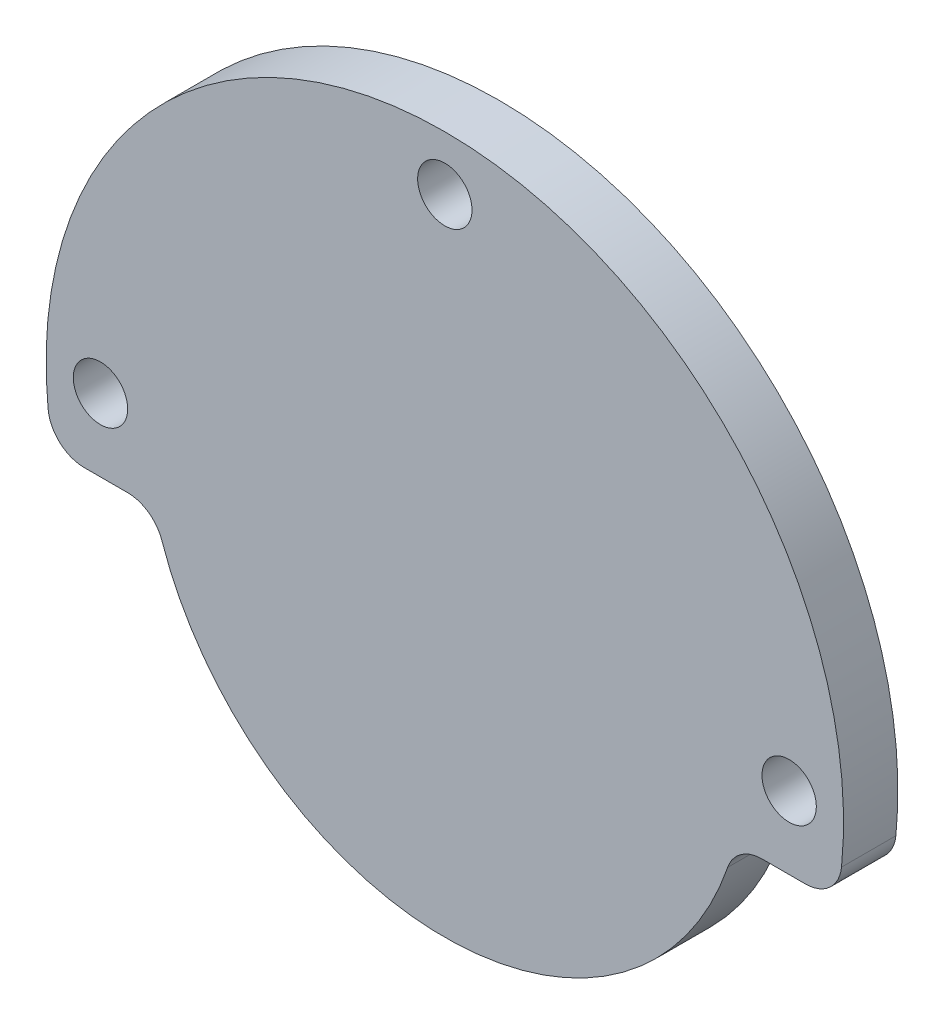
ISO-10303-21;
HEADER;
FILE_DESCRIPTION(('STEP AP214'),'2;1');
FILE_NAME('part.step','',(''),(''),'','','');
FILE_SCHEMA(('AUTOMOTIVE_DESIGN { 1 0 10303 214 1 1 1 1 }'));
ENDSEC;
DATA;
#1=APPLICATION_CONTEXT('core data for automotive mechanical design processes');
#2=APPLICATION_PROTOCOL_DEFINITION('international standard','automotive_design',2000,#1);
#3=PRODUCT_CONTEXT('',#1,'mechanical');
#4=PRODUCT('Part','Part','',(#3));
#5=PRODUCT_RELATED_PRODUCT_CATEGORY('part','',(#4));
#6=PRODUCT_DEFINITION_FORMATION('','',#4);
#7=PRODUCT_DEFINITION_CONTEXT('part definition',#1,'design');
#8=PRODUCT_DEFINITION('design','',#6,#7);
#9=PRODUCT_DEFINITION_SHAPE('','',#8);
#10=(LENGTH_UNIT() NAMED_UNIT(*) SI_UNIT(.MILLI.,.METRE.));
#11=(NAMED_UNIT(*) PLANE_ANGLE_UNIT() SI_UNIT($,.RADIAN.));
#12=(NAMED_UNIT(*) SI_UNIT($,.STERADIAN.) SOLID_ANGLE_UNIT());
#13=UNCERTAINTY_MEASURE_WITH_UNIT(LENGTH_MEASURE(1.E-05),#10,'distance_accuracy_value','');
#14=(GEOMETRIC_REPRESENTATION_CONTEXT(3) GLOBAL_UNCERTAINTY_ASSIGNED_CONTEXT((#13)) GLOBAL_UNIT_ASSIGNED_CONTEXT((#10,
#11,#12)) REPRESENTATION_CONTEXT('',''));
#15=CARTESIAN_POINT('',(0.,0.,0.));
#16=DIRECTION('',(0.,0.,1.));
#17=DIRECTION('',(1.,0.,0.));
#18=AXIS2_PLACEMENT_3D('',#15,#16,#17);
#19=CARTESIAN_POINT('',(0.,0.,3.));
#20=DIRECTION('',(0.,0.,1.));
#21=DIRECTION('',(1.,0.,0.));
#22=AXIS2_PLACEMENT_3D('',#19,#20,#21);
#23=PLANE('',#22);
#24=CARTESIAN_POINT('',(0.,19.,3.));
#25=DIRECTION('',(0.,0.,1.));
#26=DIRECTION('',(1.,0.,0.));
#27=AXIS2_PLACEMENT_3D('',#24,#25,#26);
#28=CIRCLE('',#27,1.5);
#29=CARTESIAN_POINT('',(1.5,19.,3.));
#30=VERTEX_POINT('',#29);
#31=EDGE_CURVE('E185',#30,#30,#28,.T.);
#32=ORIENTED_EDGE('',*,*,#31,.F.);
#33=EDGE_LOOP('',(#32));
#34=FACE_BOUND('',#33,.T.);
#35=DIRECTION('',(1.,0.,0.));
#36=VECTOR('',#35,1.);
#37=CARTESIAN_POINT('',(16.0078105935821,-4.,3.));
#38=LINE('',#37,#36);
#39=CARTESIAN_POINT('',(17.5,-4.,3.));
#40=VERTEX_POINT('',#39);
#41=CARTESIAN_POINT('',(19.8997487421324,-4.,3.));
#42=VERTEX_POINT('',#41);
#43=EDGE_CURVE('E172',#40,#42,#38,.T.);
#44=ORIENTED_EDGE('',*,*,#43,.T.);
#45=CARTESIAN_POINT('',(19.8997487421324,-2.,3.));
#46=DIRECTION('',(0.,0.,1.));
#47=DIRECTION('',(1.,0.,0.));
#48=AXIS2_PLACEMENT_3D('',#45,#46,#47);
#49=CIRCLE('',#48,2.);
#50=CARTESIAN_POINT('',(21.8897236163456,-2.2,3.));
#51=VERTEX_POINT('',#50);
#52=EDGE_CURVE('E142',#42,#51,#49,.T.);
#53=ORIENTED_EDGE('',*,*,#52,.T.);
#54=CARTESIAN_POINT('',(0.,0.,3.));
#55=DIRECTION('',(0.,0.,1.));
#56=DIRECTION('',(1.,0.,0.));
#57=AXIS2_PLACEMENT_3D('',#54,#55,#56);
#58=CIRCLE('',#57,22.);
#59=CARTESIAN_POINT('',(-21.8897236163456,-2.2,3.));
#60=VERTEX_POINT('',#59);
#61=EDGE_CURVE('E120',#51,#60,#58,.T.);
#62=ORIENTED_EDGE('',*,*,#61,.T.);
#63=CARTESIAN_POINT('',(-19.8997487421324,-2.,3.));
#64=DIRECTION('',(0.,0.,1.));
#65=DIRECTION('',(1.,0.,0.));
#66=AXIS2_PLACEMENT_3D('',#63,#64,#65);
#67=CIRCLE('',#66,2.);
#68=CARTESIAN_POINT('',(-19.8997487421324,-4.,3.));
#69=VERTEX_POINT('',#68);
#70=EDGE_CURVE('E57',#60,#69,#67,.T.);
#71=ORIENTED_EDGE('',*,*,#70,.T.);
#72=DIRECTION('',(1.,0.,0.));
#73=VECTOR('',#72,1.);
#74=CARTESIAN_POINT('',(-16.0078105935821,-4.,3.));
#75=LINE('',#74,#73);
#76=CARTESIAN_POINT('',(-17.5,-4.,3.));
#77=VERTEX_POINT('',#76);
#78=EDGE_CURVE('E135',#69,#77,#75,.T.);
#79=ORIENTED_EDGE('',*,*,#78,.T.);
#80=CARTESIAN_POINT('',(-17.5,-6.,3.));
#81=DIRECTION('',(0.,0.,1.));
#82=DIRECTION('',(1.,0.,0.));
#83=AXIS2_PLACEMENT_3D('',#80,#81,#82);
#84=CIRCLE('',#83,2.);
#85=CARTESIAN_POINT('',(-15.6081081081081,-5.35135135135135,3.));
#86=VERTEX_POINT('',#85);
#87=EDGE_CURVE('E11',#77,#86,#84,.F.);
#88=ORIENTED_EDGE('',*,*,#87,.T.);
#89=CARTESIAN_POINT('',(0.,0.,3.));
#90=DIRECTION('',(0.,0.,1.));
#91=DIRECTION('',(1.,0.,0.));
#92=AXIS2_PLACEMENT_3D('',#89,#90,#91);
#93=CIRCLE('',#92,16.5);
#94=CARTESIAN_POINT('',(15.6081081081081,-5.35135135135135,3.));
#95=VERTEX_POINT('',#94);
#96=EDGE_CURVE('E129',#86,#95,#93,.T.);
#97=ORIENTED_EDGE('',*,*,#96,.T.);
#98=CARTESIAN_POINT('',(17.5,-6.,3.));
#99=DIRECTION('',(0.,0.,1.));
#100=DIRECTION('',(1.,0.,0.));
#101=AXIS2_PLACEMENT_3D('',#98,#99,#100);
#102=CIRCLE('',#101,2.);
#103=EDGE_CURVE('E155',#95,#40,#102,.F.);
#104=ORIENTED_EDGE('',*,*,#103,.T.);
#105=EDGE_LOOP('',(#44,#53,#62,#71,#79,#88,#97,#104));
#106=FACE_BOUND('',#105,.T.);
#107=CARTESIAN_POINT('',(-19.,0.,3.));
#108=DIRECTION('',(0.,0.,1.));
#109=DIRECTION('',(1.,0.,0.));
#110=AXIS2_PLACEMENT_3D('',#107,#108,#109);
#111=CIRCLE('',#110,1.5);
#112=CARTESIAN_POINT('',(-17.5,0.,3.));
#113=VERTEX_POINT('',#112);
#114=EDGE_CURVE('E180',#113,#113,#111,.T.);
#115=ORIENTED_EDGE('',*,*,#114,.F.);
#116=EDGE_LOOP('',(#115));
#117=FACE_BOUND('',#116,.T.);
#118=CARTESIAN_POINT('',(19.,0.,3.));
#119=DIRECTION('',(0.,0.,1.));
#120=DIRECTION('',(1.,0.,0.));
#121=AXIS2_PLACEMENT_3D('',#118,#119,#120);
#122=CIRCLE('',#121,1.5);
#123=CARTESIAN_POINT('',(20.5,0.,3.));
#124=VERTEX_POINT('',#123);
#125=EDGE_CURVE('E190',#124,#124,#122,.T.);
#126=ORIENTED_EDGE('',*,*,#125,.F.);
#127=EDGE_LOOP('',(#126));
#128=FACE_BOUND('',#127,.T.);
#129=ADVANCED_FACE('F35',(#34,#106,#117,#128),#23,.T.);
#130=CARTESIAN_POINT('',(0.,0.,0.));
#131=DIRECTION('',(0.,0.,1.));
#132=DIRECTION('',(1.,0.,0.));
#133=AXIS2_PLACEMENT_3D('',#130,#131,#132);
#134=PLANE('',#133);
#135=CARTESIAN_POINT('',(0.,0.,0.));
#136=DIRECTION('',(0.,0.,1.));
#137=DIRECTION('',(1.,0.,0.));
#138=AXIS2_PLACEMENT_3D('',#135,#136,#137);
#139=CIRCLE('',#138,22.);
#140=CARTESIAN_POINT('',(21.8897236163456,-2.2,0.));
#141=VERTEX_POINT('',#140);
#142=CARTESIAN_POINT('',(-21.8897236163456,-2.2,0.));
#143=VERTEX_POINT('',#142);
#144=EDGE_CURVE('E118',#141,#143,#139,.T.);
#145=ORIENTED_EDGE('',*,*,#144,.F.);
#146=CARTESIAN_POINT('',(19.8997487421324,-2.,0.));
#147=DIRECTION('',(0.,0.,1.));
#148=DIRECTION('',(1.,0.,0.));
#149=AXIS2_PLACEMENT_3D('',#146,#147,#148);
#150=CIRCLE('',#149,2.);
#151=CARTESIAN_POINT('',(19.8997487421324,-4.,0.));
#152=VERTEX_POINT('',#151);
#153=EDGE_CURVE('E101',#141,#152,#150,.F.);
#154=ORIENTED_EDGE('',*,*,#153,.T.);
#155=DIRECTION('',(1.,0.,0.));
#156=VECTOR('',#155,1.);
#157=CARTESIAN_POINT('',(16.0078105935821,-4.,0.));
#158=LINE('',#157,#156);
#159=CARTESIAN_POINT('',(17.5,-4.,0.));
#160=VERTEX_POINT('',#159);
#161=EDGE_CURVE('E127',#160,#152,#158,.T.);
#162=ORIENTED_EDGE('',*,*,#161,.F.);
#163=CARTESIAN_POINT('',(17.5,-6.,0.));
#164=DIRECTION('',(0.,0.,1.));
#165=DIRECTION('',(1.,0.,0.));
#166=AXIS2_PLACEMENT_3D('',#163,#164,#165);
#167=CIRCLE('',#166,2.);
#168=CARTESIAN_POINT('',(15.6081081081081,-5.35135135135135,0.));
#169=VERTEX_POINT('',#168);
#170=EDGE_CURVE('E153',#160,#169,#167,.T.);
#171=ORIENTED_EDGE('',*,*,#170,.T.);
#172=CARTESIAN_POINT('',(0.,0.,0.));
#173=DIRECTION('',(0.,0.,1.));
#174=DIRECTION('',(1.,0.,0.));
#175=AXIS2_PLACEMENT_3D('',#172,#173,#174);
#176=CIRCLE('',#175,16.5);
#177=CARTESIAN_POINT('',(-15.6081081081081,-5.35135135135135,0.));
#178=VERTEX_POINT('',#177);
#179=EDGE_CURVE('E131',#178,#169,#176,.T.);
#180=ORIENTED_EDGE('',*,*,#179,.F.);
#181=CARTESIAN_POINT('',(-17.5,-6.,0.));
#182=DIRECTION('',(0.,0.,1.));
#183=DIRECTION('',(1.,0.,0.));
#184=AXIS2_PLACEMENT_3D('',#181,#182,#183);
#185=CIRCLE('',#184,2.);
#186=CARTESIAN_POINT('',(-17.5,-4.,0.));
#187=VERTEX_POINT('',#186);
#188=EDGE_CURVE('E43',#178,#187,#185,.T.);
#189=ORIENTED_EDGE('',*,*,#188,.T.);
#190=DIRECTION('',(1.,0.,0.));
#191=VECTOR('',#190,1.);
#192=CARTESIAN_POINT('',(-16.0078105935821,-4.,0.));
#193=LINE('',#192,#191);
#194=CARTESIAN_POINT('',(-19.8997487421324,-4.,0.));
#195=VERTEX_POINT('',#194);
#196=EDGE_CURVE('E126',#195,#187,#193,.T.);
#197=ORIENTED_EDGE('',*,*,#196,.F.);
#198=CARTESIAN_POINT('',(-19.8997487421324,-2.,0.));
#199=DIRECTION('',(0.,0.,1.));
#200=DIRECTION('',(1.,0.,0.));
#201=AXIS2_PLACEMENT_3D('',#198,#199,#200);
#202=CIRCLE('',#201,2.);
#203=EDGE_CURVE('E112',#195,#143,#202,.F.);
#204=ORIENTED_EDGE('',*,*,#203,.T.);
#205=EDGE_LOOP('',(#145,#154,#162,#171,#180,#189,#197,#204));
#206=FACE_BOUND('',#205,.T.);
#207=CARTESIAN_POINT('',(-19.,0.,0.));
#208=DIRECTION('',(0.,0.,1.));
#209=DIRECTION('',(1.,0.,0.));
#210=AXIS2_PLACEMENT_3D('',#207,#208,#209);
#211=CIRCLE('',#210,1.5);
#212=CARTESIAN_POINT('',(-17.5,0.,0.));
#213=VERTEX_POINT('',#212);
#214=EDGE_CURVE('E176',#213,#213,#211,.T.);
#215=ORIENTED_EDGE('',*,*,#214,.T.);
#216=EDGE_LOOP('',(#215));
#217=FACE_BOUND('',#216,.T.);
#218=CARTESIAN_POINT('',(0.,19.,0.));
#219=DIRECTION('',(0.,0.,1.));
#220=DIRECTION('',(1.,0.,0.));
#221=AXIS2_PLACEMENT_3D('',#218,#219,#220);
#222=CIRCLE('',#221,1.5);
#223=CARTESIAN_POINT('',(1.5,19.,0.));
#224=VERTEX_POINT('',#223);
#225=EDGE_CURVE('E187',#224,#224,#222,.T.);
#226=ORIENTED_EDGE('',*,*,#225,.T.);
#227=EDGE_LOOP('',(#226));
#228=FACE_BOUND('',#227,.T.);
#229=CARTESIAN_POINT('',(19.,0.,0.));
#230=DIRECTION('',(0.,0.,1.));
#231=DIRECTION('',(1.,0.,0.));
#232=AXIS2_PLACEMENT_3D('',#229,#230,#231);
#233=CIRCLE('',#232,1.5);
#234=CARTESIAN_POINT('',(20.5,0.,0.));
#235=VERTEX_POINT('',#234);
#236=EDGE_CURVE('E193',#235,#235,#233,.T.);
#237=ORIENTED_EDGE('',*,*,#236,.T.);
#238=EDGE_LOOP('',(#237));
#239=FACE_BOUND('',#238,.T.);
#240=ADVANCED_FACE('F123',(#206,#217,#228,#239),#134,.F.);
#241=CARTESIAN_POINT('',(0.,0.,3.));
#242=DIRECTION('',(0.,0.,-1.));
#243=DIRECTION('',(-1.,0.,0.));
#244=AXIS2_PLACEMENT_3D('',#241,#242,#243);
#245=CYLINDRICAL_SURFACE('',#244,16.5);
#246=ORIENTED_EDGE('',*,*,#179,.T.);
#247=DIRECTION('',(0.,0.,-1.));
#248=VECTOR('',#247,1.);
#249=CARTESIAN_POINT('',(15.6081081081081,-5.35135135135135,3.));
#250=LINE('',#249,#248);
#251=EDGE_CURVE('E147',#169,#95,#250,.F.);
#252=ORIENTED_EDGE('',*,*,#251,.T.);
#253=ORIENTED_EDGE('',*,*,#96,.F.);
#254=DIRECTION('',(0.,0.,-1.));
#255=VECTOR('',#254,1.);
#256=CARTESIAN_POINT('',(-15.6081081081081,-5.35135135135135,3.));
#257=LINE('',#256,#255);
#258=EDGE_CURVE('E144',#86,#178,#257,.T.);
#259=ORIENTED_EDGE('',*,*,#258,.T.);
#260=EDGE_LOOP('',(#246,#252,#253,#259));
#261=FACE_BOUND('',#260,.T.);
#262=ADVANCED_FACE('F170',(#261),#245,.T.);
#263=CARTESIAN_POINT('',(16.0078105935821,-4.,3.));
#264=DIRECTION('',(0.,1.,0.));
#265=DIRECTION('',(0.,0.,1.));
#266=AXIS2_PLACEMENT_3D('',#263,#264,#265);
#267=PLANE('',#266);
#268=ORIENTED_EDGE('',*,*,#161,.T.);
#269=DIRECTION('',(0.,0.,-1.));
#270=VECTOR('',#269,1.);
#271=CARTESIAN_POINT('',(19.8997487421324,-4.,3.));
#272=LINE('',#271,#270);
#273=EDGE_CURVE('E106',#152,#42,#272,.F.);
#274=ORIENTED_EDGE('',*,*,#273,.T.);
#275=ORIENTED_EDGE('',*,*,#43,.F.);
#276=DIRECTION('',(0.,0.,1.));
#277=VECTOR('',#276,1.);
#278=CARTESIAN_POINT('',(17.5,-4.,0.));
#279=LINE('',#278,#277);
#280=EDGE_CURVE('E111',#40,#160,#279,.F.);
#281=ORIENTED_EDGE('',*,*,#280,.T.);
#282=EDGE_LOOP('',(#268,#274,#275,#281));
#283=FACE_BOUND('',#282,.T.);
#284=ADVANCED_FACE('F218',(#283),#267,.F.);
#285=CARTESIAN_POINT('',(0.,0.,3.));
#286=DIRECTION('',(0.,0.,-1.));
#287=DIRECTION('',(-1.,0.,0.));
#288=AXIS2_PLACEMENT_3D('',#285,#286,#287);
#289=CYLINDRICAL_SURFACE('',#288,22.);
#290=ORIENTED_EDGE('',*,*,#61,.F.);
#291=DIRECTION('',(0.,0.,-1.));
#292=VECTOR('',#291,1.);
#293=CARTESIAN_POINT('',(21.8897236163456,-2.2,3.));
#294=LINE('',#293,#292);
#295=EDGE_CURVE('E105',#51,#141,#294,.T.);
#296=ORIENTED_EDGE('',*,*,#295,.T.);
#297=ORIENTED_EDGE('',*,*,#144,.T.);
#298=DIRECTION('',(0.,0.,-1.));
#299=VECTOR('',#298,1.);
#300=CARTESIAN_POINT('',(-21.8897236163456,-2.2,3.));
#301=LINE('',#300,#299);
#302=EDGE_CURVE('E121',#143,#60,#301,.F.);
#303=ORIENTED_EDGE('',*,*,#302,.T.);
#304=EDGE_LOOP('',(#290,#296,#297,#303));
#305=FACE_BOUND('',#304,.T.);
#306=ADVANCED_FACE('F117',(#305),#289,.T.);
#307=CARTESIAN_POINT('',(-16.0078105935821,-4.,3.));
#308=DIRECTION('',(0.,1.,0.));
#309=DIRECTION('',(0.,0.,1.));
#310=AXIS2_PLACEMENT_3D('',#307,#308,#309);
#311=PLANE('',#310);
#312=ORIENTED_EDGE('',*,*,#196,.T.);
#313=DIRECTION('',(0.,0.,1.));
#314=VECTOR('',#313,1.);
#315=CARTESIAN_POINT('',(-17.5,-4.,3.));
#316=LINE('',#315,#314);
#317=EDGE_CURVE('E50',#187,#77,#316,.T.);
#318=ORIENTED_EDGE('',*,*,#317,.T.);
#319=ORIENTED_EDGE('',*,*,#78,.F.);
#320=DIRECTION('',(0.,0.,-1.));
#321=VECTOR('',#320,1.);
#322=CARTESIAN_POINT('',(-19.8997487421324,-4.,3.));
#323=LINE('',#322,#321);
#324=EDGE_CURVE('E149',#69,#195,#323,.T.);
#325=ORIENTED_EDGE('',*,*,#324,.T.);
#326=EDGE_LOOP('',(#312,#318,#319,#325));
#327=FACE_BOUND('',#326,.T.);
#328=ADVANCED_FACE('F160',(#327),#311,.F.);
#329=CARTESIAN_POINT('',(-19.,0.,3.));
#330=DIRECTION('',(0.,0.,-1.));
#331=DIRECTION('',(-1.,0.,0.));
#332=AXIS2_PLACEMENT_3D('',#329,#330,#331);
#333=CYLINDRICAL_SURFACE('',#332,1.5);
#334=ORIENTED_EDGE('',*,*,#114,.T.);
#335=EDGE_LOOP('',(#334));
#336=FACE_BOUND('',#335,.T.);
#337=ORIENTED_EDGE('',*,*,#214,.F.);
#338=EDGE_LOOP('',(#337));
#339=FACE_BOUND('',#338,.T.);
#340=ADVANCED_FACE('F211',(#336,#339),#333,.F.);
#341=CARTESIAN_POINT('',(0.,19.,3.));
#342=DIRECTION('',(0.,0.,-1.));
#343=DIRECTION('',(-1.,0.,0.));
#344=AXIS2_PLACEMENT_3D('',#341,#342,#343);
#345=CYLINDRICAL_SURFACE('',#344,1.5);
#346=ORIENTED_EDGE('',*,*,#31,.T.);
#347=EDGE_LOOP('',(#346));
#348=FACE_BOUND('',#347,.T.);
#349=ORIENTED_EDGE('',*,*,#225,.F.);
#350=EDGE_LOOP('',(#349));
#351=FACE_BOUND('',#350,.T.);
#352=ADVANCED_FACE('F299',(#348,#351),#345,.F.);
#353=CARTESIAN_POINT('',(19.,0.,3.));
#354=DIRECTION('',(0.,0.,-1.));
#355=DIRECTION('',(-1.,0.,0.));
#356=AXIS2_PLACEMENT_3D('',#353,#354,#355);
#357=CYLINDRICAL_SURFACE('',#356,1.5);
#358=ORIENTED_EDGE('',*,*,#125,.T.);
#359=EDGE_LOOP('',(#358));
#360=FACE_BOUND('',#359,.T.);
#361=ORIENTED_EDGE('',*,*,#236,.F.);
#362=EDGE_LOOP('',(#361));
#363=FACE_BOUND('',#362,.T.);
#364=ADVANCED_FACE('F199',(#360,#363),#357,.F.);
#365=CARTESIAN_POINT('',(19.8997487421324,-2.,3.));
#366=DIRECTION('',(0.,0.,-1.));
#367=DIRECTION('',(-1.,0.,0.));
#368=AXIS2_PLACEMENT_3D('',#365,#366,#367);
#369=CYLINDRICAL_SURFACE('',#368,2.);
#370=ORIENTED_EDGE('',*,*,#52,.F.);
#371=ORIENTED_EDGE('',*,*,#273,.F.);
#372=ORIENTED_EDGE('',*,*,#153,.F.);
#373=ORIENTED_EDGE('',*,*,#295,.F.);
#374=EDGE_LOOP('',(#370,#371,#372,#373));
#375=FACE_BOUND('',#374,.T.);
#376=ADVANCED_FACE('F104',(#375),#369,.T.);
#377=CARTESIAN_POINT('',(17.5,-6.,3.));
#378=DIRECTION('',(0.,0.,-1.));
#379=DIRECTION('',(-1.,0.,0.));
#380=AXIS2_PLACEMENT_3D('',#377,#378,#379);
#381=CYLINDRICAL_SURFACE('',#380,2.);
#382=ORIENTED_EDGE('',*,*,#103,.F.);
#383=ORIENTED_EDGE('',*,*,#251,.F.);
#384=ORIENTED_EDGE('',*,*,#170,.F.);
#385=ORIENTED_EDGE('',*,*,#280,.F.);
#386=EDGE_LOOP('',(#382,#383,#384,#385));
#387=FACE_BOUND('',#386,.T.);
#388=ADVANCED_FACE('F226',(#387),#381,.F.);
#389=CARTESIAN_POINT('',(-17.5,-6.,3.));
#390=DIRECTION('',(0.,0.,-1.));
#391=DIRECTION('',(-1.,0.,0.));
#392=AXIS2_PLACEMENT_3D('',#389,#390,#391);
#393=CYLINDRICAL_SURFACE('',#392,2.);
#394=ORIENTED_EDGE('',*,*,#87,.F.);
#395=ORIENTED_EDGE('',*,*,#317,.F.);
#396=ORIENTED_EDGE('',*,*,#188,.F.);
#397=ORIENTED_EDGE('',*,*,#258,.F.);
#398=EDGE_LOOP('',(#394,#395,#396,#397));
#399=FACE_BOUND('',#398,.T.);
#400=ADVANCED_FACE('F163',(#399),#393,.F.);
#401=CARTESIAN_POINT('',(-19.8997487421324,-2.,3.));
#402=DIRECTION('',(0.,0.,-1.));
#403=DIRECTION('',(-1.,0.,0.));
#404=AXIS2_PLACEMENT_3D('',#401,#402,#403);
#405=CYLINDRICAL_SURFACE('',#404,2.);
#406=ORIENTED_EDGE('',*,*,#70,.F.);
#407=ORIENTED_EDGE('',*,*,#302,.F.);
#408=ORIENTED_EDGE('',*,*,#203,.F.);
#409=ORIENTED_EDGE('',*,*,#324,.F.);
#410=EDGE_LOOP('',(#406,#407,#408,#409));
#411=FACE_BOUND('',#410,.T.);
#412=ADVANCED_FACE('F37',(#411),#405,.T.);
#413=CLOSED_SHELL('',(#129,#240,#262,#284,#306,#328,#340,#352,#364,#376,#388,#400,#412));
#414=MANIFOLD_SOLID_BREP('B2',#413);
#415=ADVANCED_BREP_SHAPE_REPRESENTATION('',(#18,#414),#14);
#416=SHAPE_DEFINITION_REPRESENTATION(#9,#415);
ENDSEC;
END-ISO-10303-21;
